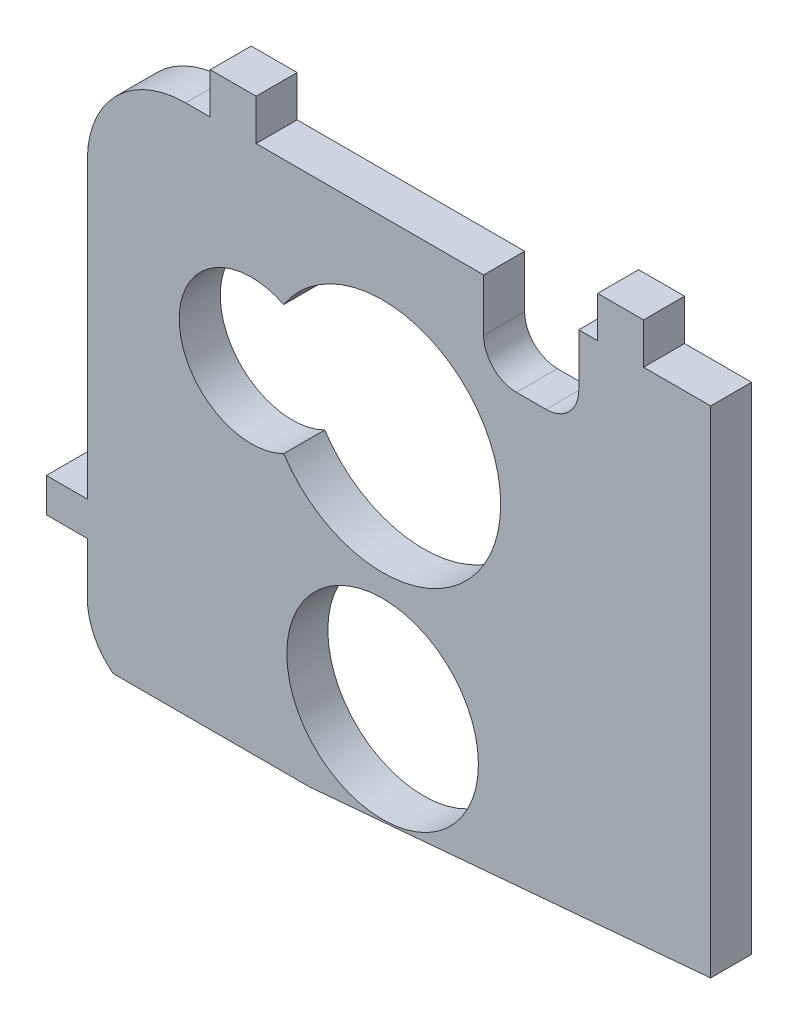
ISO-10303-21;
HEADER;
FILE_DESCRIPTION(('STEP AP214'),'2;1');
FILE_NAME('part.step','',(''),(''),'','','');
FILE_SCHEMA(('AUTOMOTIVE_DESIGN { 1 0 10303 214 1 1 1 1 }'));
ENDSEC;
DATA;
#1=APPLICATION_CONTEXT('core data for automotive mechanical design processes');
#2=APPLICATION_PROTOCOL_DEFINITION('international standard','automotive_design',2000,#1);
#3=PRODUCT_CONTEXT('',#1,'mechanical');
#4=PRODUCT('Part','Part','',(#3));
#5=PRODUCT_RELATED_PRODUCT_CATEGORY('part','',(#4));
#6=PRODUCT_DEFINITION_FORMATION('','',#4);
#7=PRODUCT_DEFINITION_CONTEXT('part definition',#1,'design');
#8=PRODUCT_DEFINITION('design','',#6,#7);
#9=PRODUCT_DEFINITION_SHAPE('','',#8);
#10=(LENGTH_UNIT() NAMED_UNIT(*) SI_UNIT(.MILLI.,.METRE.));
#11=(NAMED_UNIT(*) PLANE_ANGLE_UNIT() SI_UNIT($,.RADIAN.));
#12=(NAMED_UNIT(*) SI_UNIT($,.STERADIAN.) SOLID_ANGLE_UNIT());
#13=UNCERTAINTY_MEASURE_WITH_UNIT(LENGTH_MEASURE(1.E-05),#10,'distance_accuracy_value','');
#14=(GEOMETRIC_REPRESENTATION_CONTEXT(3) GLOBAL_UNCERTAINTY_ASSIGNED_CONTEXT((#13)) GLOBAL_UNIT_ASSIGNED_CONTEXT((#10,
#11,#12)) REPRESENTATION_CONTEXT('',''));
#15=CARTESIAN_POINT('',(0.,0.,0.));
#16=DIRECTION('',(0.,0.,1.));
#17=DIRECTION('',(1.,0.,0.));
#18=AXIS2_PLACEMENT_3D('',#15,#16,#17);
#19=CARTESIAN_POINT('',(0.632551457867364,16.51,1.5875));
#20=DIRECTION('',(0.,-1.,0.));
#21=DIRECTION('',(0.,0.,-1.));
#22=AXIS2_PLACEMENT_3D('',#19,#20,#21);
#23=PLANE('',#22);
#24=DIRECTION('',(-1.,0.,0.));
#25=VECTOR('',#24,1.);
#26=CARTESIAN_POINT('',(0.632551457867364,16.51,0.));
#27=LINE('',#26,#25);
#28=CARTESIAN_POINT('',(8.32562126019971,16.51,0.));
#29=VERTEX_POINT('',#28);
#30=CARTESIAN_POINT('',(7.59467738255905,16.51,0.));
#31=VERTEX_POINT('',#30);
#32=EDGE_CURVE('E274',#29,#31,#27,.T.);
#33=ORIENTED_EDGE('',*,*,#32,.T.);
#34=DIRECTION('',(0.,0.,1.));
#35=VECTOR('',#34,1.);
#36=CARTESIAN_POINT('',(7.59467738255905,16.51,0.));
#37=LINE('',#36,#35);
#38=CARTESIAN_POINT('',(7.59467738255905,16.51,1.5875));
#39=VERTEX_POINT('',#38);
#40=EDGE_CURVE('E286',#31,#39,#37,.T.);
#41=ORIENTED_EDGE('',*,*,#40,.T.);
#42=DIRECTION('',(-1.,0.,0.));
#43=VECTOR('',#42,1.);
#44=CARTESIAN_POINT('',(0.632551457867364,16.51,1.5875));
#45=LINE('',#44,#43);
#46=CARTESIAN_POINT('',(8.32562126019971,16.51,1.5875));
#47=VERTEX_POINT('',#46);
#48=EDGE_CURVE('E546',#47,#39,#45,.T.);
#49=ORIENTED_EDGE('',*,*,#48,.F.);
#50=DIRECTION('',(0.,0.,-1.));
#51=VECTOR('',#50,1.);
#52=CARTESIAN_POINT('',(8.32562126019971,16.51,1.5875));
#53=LINE('',#52,#51);
#54=EDGE_CURVE('E296',#47,#29,#53,.T.);
#55=ORIENTED_EDGE('',*,*,#54,.T.);
#56=EDGE_LOOP('',(#33,#41,#49,#55));
#57=FACE_BOUND('',#56,.T.);
#58=ADVANCED_FACE('F90',(#57),#23,.F.);
#59=CARTESIAN_POINT('',(-11.4299999999994,-19.1051794660288,1.5875));
#60=DIRECTION('',(1.,0.,0.));
#61=DIRECTION('',(0.,1.,0.));
#62=AXIS2_PLACEMENT_3D('',#59,#60,#61);
#63=PLANE('',#62);
#64=DIRECTION('',(0.,0.,-1.));
#65=VECTOR('',#64,1.);
#66=CARTESIAN_POINT('',(-11.4299999999998,1.3208,1.5875));
#67=LINE('',#66,#65);
#68=CARTESIAN_POINT('',(-11.4299999999998,1.3208,1.5875));
#69=VERTEX_POINT('',#68);
#70=CARTESIAN_POINT('',(-11.4299999999998,1.3208,0.));
#71=VERTEX_POINT('',#70);
#72=EDGE_CURVE('E342',#69,#71,#67,.T.);
#73=ORIENTED_EDGE('',*,*,#72,.F.);
#74=DIRECTION('',(0.,-1.,0.));
#75=VECTOR('',#74,1.);
#76=CARTESIAN_POINT('',(-11.4299999999994,-19.1051794660288,1.5875));
#77=LINE('',#76,#75);
#78=CARTESIAN_POINT('',(-11.43,12.7,1.5875));
#79=VERTEX_POINT('',#78);
#80=EDGE_CURVE('E562',#79,#69,#77,.T.);
#81=ORIENTED_EDGE('',*,*,#80,.F.);
#82=DIRECTION('',(0.,0.,-1.));
#83=VECTOR('',#82,1.);
#84=CARTESIAN_POINT('',(-11.43,12.7,1.5875));
#85=LINE('',#84,#83);
#86=CARTESIAN_POINT('',(-11.43,12.7,0.));
#87=VERTEX_POINT('',#86);
#88=EDGE_CURVE('E346',#79,#87,#85,.T.);
#89=ORIENTED_EDGE('',*,*,#88,.T.);
#90=DIRECTION('',(0.,-1.,0.));
#91=VECTOR('',#90,1.);
#92=CARTESIAN_POINT('',(-11.4299999999994,-19.1051794660288,0.));
#93=LINE('',#92,#91);
#94=EDGE_CURVE('E324',#87,#71,#93,.T.);
#95=ORIENTED_EDGE('',*,*,#94,.T.);
#96=EDGE_LOOP('',(#73,#81,#89,#95));
#97=FACE_BOUND('',#96,.T.);
#98=ADVANCED_FACE('F433',(#97),#63,.F.);
#99=CARTESIAN_POINT('',(-5.08,9.144,1.5875));
#100=DIRECTION('',(0.,0.,-1.));
#101=DIRECTION('',(-1.,0.,0.));
#102=AXIS2_PLACEMENT_3D('',#99,#100,#101);
#103=CYLINDRICAL_SURFACE('',#102,2.794);
#104=CARTESIAN_POINT('',(-5.08,9.144,0.));
#105=DIRECTION('',(0.,0.,1.));
#106=DIRECTION('',(1.,0.,0.));
#107=AXIS2_PLACEMENT_3D('',#104,#105,#106);
#108=CIRCLE('',#107,2.794);
#109=CARTESIAN_POINT('',(-3.82905,11.6423114492593,0.));
#110=VERTEX_POINT('',#109);
#111=CARTESIAN_POINT('',(-3.82905,6.64568855074072,0.));
#112=VERTEX_POINT('',#111);
#113=EDGE_CURVE('E327',#110,#112,#108,.T.);
#114=ORIENTED_EDGE('',*,*,#113,.F.);
#115=DIRECTION('',(0.,0.,-1.));
#116=VECTOR('',#115,1.);
#117=CARTESIAN_POINT('',(-3.82905,11.6423114492593,1.5875));
#118=LINE('',#117,#116);
#119=CARTESIAN_POINT('',(-3.82905,11.6423114492593,1.5875));
#120=VERTEX_POINT('',#119);
#121=EDGE_CURVE('E339',#120,#110,#118,.T.);
#122=ORIENTED_EDGE('',*,*,#121,.F.);
#123=CARTESIAN_POINT('',(-5.08,9.144,1.5875));
#124=DIRECTION('',(0.,0.,1.));
#125=DIRECTION('',(1.,0.,0.));
#126=AXIS2_PLACEMENT_3D('',#123,#124,#125);
#127=CIRCLE('',#126,2.794);
#128=CARTESIAN_POINT('',(-3.82905,6.64568855074072,1.5875));
#129=VERTEX_POINT('',#128);
#130=EDGE_CURVE('E565',#120,#129,#127,.T.);
#131=ORIENTED_EDGE('',*,*,#130,.T.);
#132=DIRECTION('',(0.,0.,-1.));
#133=VECTOR('',#132,1.);
#134=CARTESIAN_POINT('',(-3.82905,6.64568855074072,1.5875));
#135=LINE('',#134,#133);
#136=EDGE_CURVE('E337',#129,#112,#135,.T.);
#137=ORIENTED_EDGE('',*,*,#136,.T.);
#138=EDGE_LOOP('',(#114,#122,#131,#137));
#139=FACE_BOUND('',#138,.T.);
#140=ADVANCED_FACE('F441',(#139),#103,.F.);
#141=CARTESIAN_POINT('',(-8.88999999999971,-2.00942484477485,1.5875));
#142=DIRECTION('',(0.,0.,-1.));
#143=DIRECTION('',(-1.,0.,0.));
#144=AXIS2_PLACEMENT_3D('',#141,#142,#143);
#145=CYLINDRICAL_SURFACE('',#144,2.54);
#146=CARTESIAN_POINT('',(-8.88999999999971,-2.00942484477485,0.));
#147=DIRECTION('',(0.,0.,1.));
#148=DIRECTION('',(1.,0.,0.));
#149=AXIS2_PLACEMENT_3D('',#146,#147,#148);
#150=CIRCLE('',#149,2.54);
#151=CARTESIAN_POINT('',(-10.4312651908125,-4.02836060690026,0.));
#152=VERTEX_POINT('',#151);
#153=CARTESIAN_POINT('',(-11.4299999999997,-2.00942484477485,0.));
#154=VERTEX_POINT('',#153);
#155=EDGE_CURVE('E400',#152,#154,#150,.F.);
#156=ORIENTED_EDGE('',*,*,#155,.F.);
#157=DIRECTION('',(0.,0.,-1.));
#158=VECTOR('',#157,1.);
#159=CARTESIAN_POINT('',(-10.4312651908125,-4.02836060690026,1.5875));
#160=LINE('',#159,#158);
#161=CARTESIAN_POINT('',(-10.4312651908125,-4.02836060690026,1.5875));
#162=VERTEX_POINT('',#161);
#163=EDGE_CURVE('E340',#162,#152,#160,.T.);
#164=ORIENTED_EDGE('',*,*,#163,.F.);
#165=CARTESIAN_POINT('',(-8.88999999999971,-2.00942484477485,1.5875));
#166=DIRECTION('',(0.,0.,1.));
#167=DIRECTION('',(1.,0.,0.));
#168=AXIS2_PLACEMENT_3D('',#165,#166,#167);
#169=CIRCLE('',#168,2.54);
#170=CARTESIAN_POINT('',(-11.4299999999997,-2.00942484477485,1.5875));
#171=VERTEX_POINT('',#170);
#172=EDGE_CURVE('E336',#162,#171,#169,.F.);
#173=ORIENTED_EDGE('',*,*,#172,.T.);
#174=DIRECTION('',(0.,0.,-1.));
#175=VECTOR('',#174,1.);
#176=CARTESIAN_POINT('',(-11.4299999999997,-2.00942484477485,1.5875));
#177=LINE('',#176,#175);
#178=EDGE_CURVE('E343',#171,#154,#177,.T.);
#179=ORIENTED_EDGE('',*,*,#178,.T.);
#180=EDGE_LOOP('',(#156,#164,#173,#179));
#181=FACE_BOUND('',#180,.T.);
#182=ADVANCED_FACE('F475',(#181),#145,.T.);
#183=CARTESIAN_POINT('',(0.632551457867364,-4.02836060690026,1.5875));
#184=DIRECTION('',(0.,-1.,0.));
#185=DIRECTION('',(0.,0.,-1.));
#186=AXIS2_PLACEMENT_3D('',#183,#184,#185);
#187=PLANE('',#186);
#188=DIRECTION('',(-1.,0.,0.));
#189=VECTOR('',#188,1.);
#190=CARTESIAN_POINT('',(0.632551457867364,-4.02836060690026,0.));
#191=LINE('',#190,#189);
#192=CARTESIAN_POINT('',(-2.82330971300655,-4.02836060690026,0.));
#193=VERTEX_POINT('',#192);
#194=EDGE_CURVE('E575',#193,#152,#191,.T.);
#195=ORIENTED_EDGE('',*,*,#194,.F.);
#196=DIRECTION('',(0.,0.,-1.));
#197=VECTOR('',#196,1.);
#198=CARTESIAN_POINT('',(-2.82330971300655,-4.02836060690026,1.5875));
#199=LINE('',#198,#197);
#200=CARTESIAN_POINT('',(-2.82330971300655,-4.02836060690026,1.5875));
#201=VERTEX_POINT('',#200);
#202=EDGE_CURVE('E373',#201,#193,#199,.T.);
#203=ORIENTED_EDGE('',*,*,#202,.F.);
#204=DIRECTION('',(-1.,0.,0.));
#205=VECTOR('',#204,1.);
#206=CARTESIAN_POINT('',(0.632551457867364,-4.02836060690026,1.5875));
#207=LINE('',#206,#205);
#208=EDGE_CURVE('E534',#201,#162,#207,.T.);
#209=ORIENTED_EDGE('',*,*,#208,.T.);
#210=ORIENTED_EDGE('',*,*,#163,.T.);
#211=EDGE_LOOP('',(#195,#203,#209,#210));
#212=FACE_BOUND('',#211,.T.);
#213=ADVANCED_FACE('F478',(#212),#187,.T.);
#214=CARTESIAN_POINT('',(-0.702730750315264,-3.84283398755323,1.5875));
#215=DIRECTION('',(0.0871557427476512,-0.996194698091746,0.));
#216=DIRECTION('',(0.996194698091746,0.0871557427476512,0.));
#217=AXIS2_PLACEMENT_3D('',#214,#215,#216);
#218=PLANE('',#217);
#219=DIRECTION('',(-0.996194698091746,-0.0871557427476512,0.));
#220=VECTOR('',#219,1.);
#221=CARTESIAN_POINT('',(-0.702730750315264,-3.84283398755323,0.));
#222=LINE('',#221,#220);
#223=CARTESIAN_POINT('',(12.7,-2.67024698661043,0.));
#224=VERTEX_POINT('',#223);
#225=EDGE_CURVE('E578',#224,#193,#222,.T.);
#226=ORIENTED_EDGE('',*,*,#225,.F.);
#227=DIRECTION('',(0.,0.,-1.));
#228=VECTOR('',#227,1.);
#229=CARTESIAN_POINT('',(12.7,-2.67024698661043,1.5875));
#230=LINE('',#229,#228);
#231=CARTESIAN_POINT('',(12.7,-2.67024698661043,1.5875));
#232=VERTEX_POINT('',#231);
#233=EDGE_CURVE('E371',#232,#224,#230,.T.);
#234=ORIENTED_EDGE('',*,*,#233,.F.);
#235=DIRECTION('',(-0.996194698091746,-0.0871557427476512,0.));
#236=VECTOR('',#235,1.);
#237=CARTESIAN_POINT('',(-0.702730750315264,-3.84283398755323,1.5875));
#238=LINE('',#237,#236);
#239=EDGE_CURVE('E537',#232,#201,#238,.T.);
#240=ORIENTED_EDGE('',*,*,#239,.T.);
#241=ORIENTED_EDGE('',*,*,#202,.T.);
#242=EDGE_LOOP('',(#226,#234,#240,#241));
#243=FACE_BOUND('',#242,.T.);
#244=ADVANCED_FACE('F482',(#243),#218,.T.);
#245=CARTESIAN_POINT('',(12.7,-19.1051794660285,1.5875));
#246=DIRECTION('',(1.,0.,0.));
#247=DIRECTION('',(0.,1.,0.));
#248=AXIS2_PLACEMENT_3D('',#245,#246,#247);
#249=PLANE('',#248);
#250=DIRECTION('',(0.,-1.,0.));
#251=VECTOR('',#250,1.);
#252=CARTESIAN_POINT('',(12.7,-19.1051794660285,0.));
#253=LINE('',#252,#251);
#254=CARTESIAN_POINT('',(12.7,16.51,0.));
#255=VERTEX_POINT('',#254);
#256=EDGE_CURVE('E309',#255,#224,#253,.T.);
#257=ORIENTED_EDGE('',*,*,#256,.F.);
#258=DIRECTION('',(0.,0.,-1.));
#259=VECTOR('',#258,1.);
#260=CARTESIAN_POINT('',(12.7,16.51,1.5875));
#261=LINE('',#260,#259);
#262=CARTESIAN_POINT('',(12.7,16.51,1.5875));
#263=VERTEX_POINT('',#262);
#264=EDGE_CURVE('E369',#263,#255,#261,.T.);
#265=ORIENTED_EDGE('',*,*,#264,.F.);
#266=DIRECTION('',(0.,-1.,0.));
#267=VECTOR('',#266,1.);
#268=CARTESIAN_POINT('',(12.7,-19.1051794660285,1.5875));
#269=LINE('',#268,#267);
#270=EDGE_CURVE('E540',#263,#232,#269,.T.);
#271=ORIENTED_EDGE('',*,*,#270,.T.);
#272=ORIENTED_EDGE('',*,*,#233,.T.);
#273=EDGE_LOOP('',(#257,#265,#271,#272));
#274=FACE_BOUND('',#273,.T.);
#275=ADVANCED_FACE('F450',(#274),#249,.T.);
#276=CARTESIAN_POINT('',(10.1036212601997,16.51,0.));
#277=VERTEX_POINT('',#276);
#278=EDGE_CURVE('E300',#255,#277,#27,.T.);
#279=ORIENTED_EDGE('',*,*,#278,.T.);
#280=DIRECTION('',(0.,0.,-1.));
#281=VECTOR('',#280,1.);
#282=CARTESIAN_POINT('',(10.1036212601997,16.51,1.5875));
#283=LINE('',#282,#281);
#284=CARTESIAN_POINT('',(10.1036212601997,16.51,1.5875));
#285=VERTEX_POINT('',#284);
#286=EDGE_CURVE('E366',#285,#277,#283,.T.);
#287=ORIENTED_EDGE('',*,*,#286,.F.);
#288=EDGE_CURVE('E543',#263,#285,#45,.T.);
#289=ORIENTED_EDGE('',*,*,#288,.F.);
#290=ORIENTED_EDGE('',*,*,#264,.T.);
#291=EDGE_LOOP('',(#279,#287,#289,#290));
#292=FACE_BOUND('',#291,.T.);
#293=ADVANCED_FACE('F435',(#292),#23,.F.);
#294=CARTESIAN_POINT('',(10.1036212601997,-19.1051794660285,1.5875));
#295=DIRECTION('',(-1.,0.,0.));
#296=DIRECTION('',(0.,0.,1.));
#297=AXIS2_PLACEMENT_3D('',#294,#295,#296);
#298=PLANE('',#297);
#299=DIRECTION('',(0.,1.,0.));
#300=VECTOR('',#299,1.);
#301=CARTESIAN_POINT('',(10.1036212601997,-19.1051794660285,0.));
#302=LINE('',#301,#300);
#303=CARTESIAN_POINT('',(10.1036212601997,18.0975,0.));
#304=VERTEX_POINT('',#303);
#305=EDGE_CURVE('E308',#277,#304,#302,.T.);
#306=ORIENTED_EDGE('',*,*,#305,.T.);
#307=DIRECTION('',(0.,0.,-1.));
#308=VECTOR('',#307,1.);
#309=CARTESIAN_POINT('',(10.1036212601997,18.0975,1.5875));
#310=LINE('',#309,#308);
#311=CARTESIAN_POINT('',(10.1036212601997,18.0975,1.5875));
#312=VERTEX_POINT('',#311);
#313=EDGE_CURVE('E364',#312,#304,#310,.T.);
#314=ORIENTED_EDGE('',*,*,#313,.F.);
#315=DIRECTION('',(0.,1.,0.));
#316=VECTOR('',#315,1.);
#317=CARTESIAN_POINT('',(10.1036212601997,-19.1051794660285,1.5875));
#318=LINE('',#317,#316);
#319=EDGE_CURVE('E545',#285,#312,#318,.T.);
#320=ORIENTED_EDGE('',*,*,#319,.F.);
#321=ORIENTED_EDGE('',*,*,#286,.T.);
#322=EDGE_LOOP('',(#306,#314,#320,#321));
#323=FACE_BOUND('',#322,.T.);
#324=ADVANCED_FACE('F449',(#323),#298,.F.);
#325=CARTESIAN_POINT('',(0.632551457867509,18.0975,1.5875));
#326=DIRECTION('',(0.,1.,0.));
#327=DIRECTION('',(-1.,0.,0.));
#328=AXIS2_PLACEMENT_3D('',#325,#326,#327);
#329=PLANE('',#328);
#330=DIRECTION('',(1.,0.,0.));
#331=VECTOR('',#330,1.);
#332=CARTESIAN_POINT('',(0.632551457867509,18.0975,0.));
#333=LINE('',#332,#331);
#334=CARTESIAN_POINT('',(8.32562126019971,18.0975,0.));
#335=VERTEX_POINT('',#334);
#336=EDGE_CURVE('E612',#335,#304,#333,.T.);
#337=ORIENTED_EDGE('',*,*,#336,.F.);
#338=DIRECTION('',(0.,0.,-1.));
#339=VECTOR('',#338,1.);
#340=CARTESIAN_POINT('',(8.32562126019971,18.0975,1.5875));
#341=LINE('',#340,#339);
#342=CARTESIAN_POINT('',(8.32562126019971,18.0975,1.5875));
#343=VERTEX_POINT('',#342);
#344=EDGE_CURVE('E362',#343,#335,#341,.T.);
#345=ORIENTED_EDGE('',*,*,#344,.F.);
#346=DIRECTION('',(1.,0.,0.));
#347=VECTOR('',#346,1.);
#348=CARTESIAN_POINT('',(0.632551457867509,18.0975,1.5875));
#349=LINE('',#348,#347);
#350=EDGE_CURVE('E548',#343,#312,#349,.T.);
#351=ORIENTED_EDGE('',*,*,#350,.T.);
#352=ORIENTED_EDGE('',*,*,#313,.T.);
#353=EDGE_LOOP('',(#337,#345,#351,#352));
#354=FACE_BOUND('',#353,.T.);
#355=ADVANCED_FACE('F492',(#354),#329,.T.);
#356=CARTESIAN_POINT('',(8.32562126019971,-19.1051794660285,1.5875));
#357=DIRECTION('',(-1.,0.,0.));
#358=DIRECTION('',(0.,0.,1.));
#359=AXIS2_PLACEMENT_3D('',#356,#357,#358);
#360=PLANE('',#359);
#361=DIRECTION('',(0.,1.,0.));
#362=VECTOR('',#361,1.);
#363=CARTESIAN_POINT('',(8.32562126019971,-19.1051794660285,0.));
#364=LINE('',#363,#362);
#365=EDGE_CURVE('E305',#29,#335,#364,.T.);
#366=ORIENTED_EDGE('',*,*,#365,.F.);
#367=ORIENTED_EDGE('',*,*,#54,.F.);
#368=DIRECTION('',(0.,1.,0.));
#369=VECTOR('',#368,1.);
#370=CARTESIAN_POINT('',(8.32562126019971,-19.1051794660285,1.5875));
#371=LINE('',#370,#369);
#372=EDGE_CURVE('E551',#47,#343,#371,.T.);
#373=ORIENTED_EDGE('',*,*,#372,.T.);
#374=ORIENTED_EDGE('',*,*,#344,.T.);
#375=EDGE_LOOP('',(#366,#367,#373,#374));
#376=FACE_BOUND('',#375,.T.);
#377=ADVANCED_FACE('F496',(#376),#360,.T.);
#378=CARTESIAN_POINT('',(3.91167738255905,16.51,1.5875));
#379=VERTEX_POINT('',#378);
#380=CARTESIAN_POINT('',(-4.89637873980029,16.51,1.5875));
#381=VERTEX_POINT('',#380);
#382=EDGE_CURVE('E528',#379,#381,#45,.T.);
#383=ORIENTED_EDGE('',*,*,#382,.F.);
#384=DIRECTION('',(0.,0.,1.));
#385=VECTOR('',#384,1.);
#386=CARTESIAN_POINT('',(3.91167738255905,16.51,0.));
#387=LINE('',#386,#385);
#388=CARTESIAN_POINT('',(3.91167738255905,16.51,0.));
#389=VERTEX_POINT('',#388);
#390=EDGE_CURVE('E293',#389,#379,#387,.T.);
#391=ORIENTED_EDGE('',*,*,#390,.F.);
#392=CARTESIAN_POINT('',(-4.89637873980029,16.51,0.));
#393=VERTEX_POINT('',#392);
#394=EDGE_CURVE('E298',#389,#393,#27,.T.);
#395=ORIENTED_EDGE('',*,*,#394,.T.);
#396=DIRECTION('',(0.,0.,-1.));
#397=VECTOR('',#396,1.);
#398=CARTESIAN_POINT('',(-4.89637873980029,16.51,1.5875));
#399=LINE('',#398,#397);
#400=EDGE_CURVE('E358',#381,#393,#399,.T.);
#401=ORIENTED_EDGE('',*,*,#400,.F.);
#402=EDGE_LOOP('',(#383,#391,#395,#401));
#403=FACE_BOUND('',#402,.T.);
#404=ADVANCED_FACE('F452',(#403),#23,.F.);
#405=CARTESIAN_POINT('',(-4.89637873980029,-19.1051794660285,1.5875));
#406=DIRECTION('',(-1.,0.,0.));
#407=DIRECTION('',(0.,0.,1.));
#408=AXIS2_PLACEMENT_3D('',#405,#406,#407);
#409=PLANE('',#408);
#410=DIRECTION('',(0.,1.,0.));
#411=VECTOR('',#410,1.);
#412=CARTESIAN_POINT('',(-4.89637873980029,-19.1051794660285,0.));
#413=LINE('',#412,#411);
#414=CARTESIAN_POINT('',(-4.89637873980029,18.0975,0.));
#415=VERTEX_POINT('',#414);
#416=EDGE_CURVE('E297',#393,#415,#413,.T.);
#417=ORIENTED_EDGE('',*,*,#416,.T.);
#418=DIRECTION('',(0.,0.,-1.));
#419=VECTOR('',#418,1.);
#420=CARTESIAN_POINT('',(-4.89637873980029,18.0975,1.5875));
#421=LINE('',#420,#419);
#422=CARTESIAN_POINT('',(-4.89637873980029,18.0975,1.5875));
#423=VERTEX_POINT('',#422);
#424=EDGE_CURVE('E356',#423,#415,#421,.T.);
#425=ORIENTED_EDGE('',*,*,#424,.F.);
#426=DIRECTION('',(0.,1.,0.));
#427=VECTOR('',#426,1.);
#428=CARTESIAN_POINT('',(-4.89637873980029,-19.1051794660285,1.5875));
#429=LINE('',#428,#427);
#430=EDGE_CURVE('E524',#381,#423,#429,.T.);
#431=ORIENTED_EDGE('',*,*,#430,.F.);
#432=ORIENTED_EDGE('',*,*,#400,.T.);
#433=EDGE_LOOP('',(#417,#425,#431,#432));
#434=FACE_BOUND('',#433,.T.);
#435=ADVANCED_FACE('F501',(#434),#409,.F.);
#436=CARTESIAN_POINT('',(0.632551457867509,18.0975,1.5875));
#437=DIRECTION('',(0.,1.,0.));
#438=DIRECTION('',(-1.,0.,0.));
#439=AXIS2_PLACEMENT_3D('',#436,#437,#438);
#440=PLANE('',#439);
#441=DIRECTION('',(1.,0.,0.));
#442=VECTOR('',#441,1.);
#443=CARTESIAN_POINT('',(0.632551457867509,18.0975,0.));
#444=LINE('',#443,#442);
#445=CARTESIAN_POINT('',(-6.67437873980029,18.0975,0.));
#446=VERTEX_POINT('',#445);
#447=EDGE_CURVE('E303',#446,#415,#444,.T.);
#448=ORIENTED_EDGE('',*,*,#447,.F.);
#449=DIRECTION('',(0.,0.,-1.));
#450=VECTOR('',#449,1.);
#451=CARTESIAN_POINT('',(-6.67437873980029,18.0975,1.5875));
#452=LINE('',#451,#450);
#453=CARTESIAN_POINT('',(-6.67437873980029,18.0975,1.5875));
#454=VERTEX_POINT('',#453);
#455=EDGE_CURVE('E354',#454,#446,#452,.T.);
#456=ORIENTED_EDGE('',*,*,#455,.F.);
#457=DIRECTION('',(1.,0.,0.));
#458=VECTOR('',#457,1.);
#459=CARTESIAN_POINT('',(0.632551457867509,18.0975,1.5875));
#460=LINE('',#459,#458);
#461=EDGE_CURVE('E555',#454,#423,#460,.T.);
#462=ORIENTED_EDGE('',*,*,#461,.T.);
#463=ORIENTED_EDGE('',*,*,#424,.T.);
#464=EDGE_LOOP('',(#448,#456,#462,#463));
#465=FACE_BOUND('',#464,.T.);
#466=ADVANCED_FACE('F504',(#465),#440,.T.);
#467=CARTESIAN_POINT('',(-6.67437873980029,-19.1051794660285,1.5875));
#468=DIRECTION('',(-1.,0.,0.));
#469=DIRECTION('',(0.,0.,1.));
#470=AXIS2_PLACEMENT_3D('',#467,#468,#469);
#471=PLANE('',#470);
#472=DIRECTION('',(0.,1.,0.));
#473=VECTOR('',#472,1.);
#474=CARTESIAN_POINT('',(-6.67437873980029,-19.1051794660285,0.));
#475=LINE('',#474,#473);
#476=CARTESIAN_POINT('',(-6.67437873980029,16.51,0.));
#477=VERTEX_POINT('',#476);
#478=EDGE_CURVE('E311',#477,#446,#475,.T.);
#479=ORIENTED_EDGE('',*,*,#478,.F.);
#480=DIRECTION('',(0.,0.,-1.));
#481=VECTOR('',#480,1.);
#482=CARTESIAN_POINT('',(-6.67437873980029,16.51,1.5875));
#483=LINE('',#482,#481);
#484=CARTESIAN_POINT('',(-6.67437873980029,16.51,1.5875));
#485=VERTEX_POINT('',#484);
#486=EDGE_CURVE('E352',#485,#477,#483,.T.);
#487=ORIENTED_EDGE('',*,*,#486,.F.);
#488=DIRECTION('',(0.,1.,0.));
#489=VECTOR('',#488,1.);
#490=CARTESIAN_POINT('',(-6.67437873980029,-19.1051794660285,1.5875));
#491=LINE('',#490,#489);
#492=EDGE_CURVE('E516',#485,#454,#491,.T.);
#493=ORIENTED_EDGE('',*,*,#492,.T.);
#494=ORIENTED_EDGE('',*,*,#455,.T.);
#495=EDGE_LOOP('',(#479,#487,#493,#494));
#496=FACE_BOUND('',#495,.T.);
#497=ADVANCED_FACE('F455',(#496),#471,.T.);
#498=CARTESIAN_POINT('',(-7.62,16.51,0.));
#499=VERTEX_POINT('',#498);
#500=EDGE_CURVE('E301',#477,#499,#27,.T.);
#501=ORIENTED_EDGE('',*,*,#500,.T.);
#502=DIRECTION('',(0.,0.,-1.));
#503=VECTOR('',#502,1.);
#504=CARTESIAN_POINT('',(-7.62,16.51,1.5875));
#505=LINE('',#504,#503);
#506=CARTESIAN_POINT('',(-7.62,16.51,1.5875));
#507=VERTEX_POINT('',#506);
#508=EDGE_CURVE('E350',#507,#499,#505,.T.);
#509=ORIENTED_EDGE('',*,*,#508,.F.);
#510=EDGE_CURVE('E558',#485,#507,#45,.T.);
#511=ORIENTED_EDGE('',*,*,#510,.F.);
#512=ORIENTED_EDGE('',*,*,#486,.T.);
#513=EDGE_LOOP('',(#501,#509,#511,#512));
#514=FACE_BOUND('',#513,.T.);
#515=ADVANCED_FACE('F436',(#514),#23,.F.);
#516=CARTESIAN_POINT('',(-7.62,12.7,1.5875));
#517=DIRECTION('',(0.,0.,-1.));
#518=DIRECTION('',(-1.,0.,0.));
#519=AXIS2_PLACEMENT_3D('',#516,#517,#518);
#520=CYLINDRICAL_SURFACE('',#519,3.81);
#521=CARTESIAN_POINT('',(-7.62,12.7,0.));
#522=DIRECTION('',(0.,0.,1.));
#523=DIRECTION('',(1.,0.,0.));
#524=AXIS2_PLACEMENT_3D('',#521,#522,#523);
#525=CIRCLE('',#524,3.81);
#526=EDGE_CURVE('E310',#499,#87,#525,.T.);
#527=ORIENTED_EDGE('',*,*,#526,.T.);
#528=ORIENTED_EDGE('',*,*,#88,.F.);
#529=CARTESIAN_POINT('',(-7.62,12.7,1.5875));
#530=DIRECTION('',(0.,0.,1.));
#531=DIRECTION('',(1.,0.,0.));
#532=AXIS2_PLACEMENT_3D('',#529,#530,#531);
#533=CIRCLE('',#532,3.81);
#534=EDGE_CURVE('E559',#507,#79,#533,.T.);
#535=ORIENTED_EDGE('',*,*,#534,.F.);
#536=ORIENTED_EDGE('',*,*,#508,.T.);
#537=EDGE_LOOP('',(#527,#528,#535,#536));
#538=FACE_BOUND('',#537,.T.);
#539=ADVANCED_FACE('F454',(#538),#520,.T.);
#540=CARTESIAN_POINT('',(0.,9.144,1.5875));
#541=DIRECTION('',(0.,0.,-1.));
#542=DIRECTION('',(-1.,0.,0.));
#543=AXIS2_PLACEMENT_3D('',#540,#541,#542);
#544=CYLINDRICAL_SURFACE('',#543,4.572);
#545=CARTESIAN_POINT('',(0.,9.144,0.));
#546=DIRECTION('',(0.,0.,1.));
#547=DIRECTION('',(1.,0.,0.));
#548=AXIS2_PLACEMENT_3D('',#545,#546,#547);
#549=CIRCLE('',#548,4.572);
#550=EDGE_CURVE('E330',#112,#110,#549,.T.);
#551=ORIENTED_EDGE('',*,*,#550,.F.);
#552=ORIENTED_EDGE('',*,*,#136,.F.);
#553=CARTESIAN_POINT('',(0.,9.144,1.5875));
#554=DIRECTION('',(0.,0.,1.));
#555=DIRECTION('',(1.,0.,0.));
#556=AXIS2_PLACEMENT_3D('',#553,#554,#555);
#557=CIRCLE('',#556,4.572);
#558=EDGE_CURVE('E568',#129,#120,#557,.T.);
#559=ORIENTED_EDGE('',*,*,#558,.T.);
#560=ORIENTED_EDGE('',*,*,#121,.T.);
#561=EDGE_LOOP('',(#551,#552,#559,#560));
#562=FACE_BOUND('',#561,.T.);
#563=ADVANCED_FACE('F624',(#562),#544,.F.);
#564=CARTESIAN_POINT('',(-11.4299999999997,0.,1.5875));
#565=VERTEX_POINT('',#564);
#566=EDGE_CURVE('E561',#565,#171,#77,.T.);
#567=ORIENTED_EDGE('',*,*,#566,.F.);
#568=DIRECTION('',(0.,0.,-1.));
#569=VECTOR('',#568,1.);
#570=CARTESIAN_POINT('',(-11.4299999999997,0.,1.5875));
#571=LINE('',#570,#569);
#572=CARTESIAN_POINT('',(-11.4299999999997,0.,0.));
#573=VERTEX_POINT('',#572);
#574=EDGE_CURVE('E377',#565,#573,#571,.T.);
#575=ORIENTED_EDGE('',*,*,#574,.T.);
#576=EDGE_CURVE('E316',#573,#154,#93,.T.);
#577=ORIENTED_EDGE('',*,*,#576,.T.);
#578=ORIENTED_EDGE('',*,*,#178,.F.);
#579=EDGE_LOOP('',(#567,#575,#577,#578));
#580=FACE_BOUND('',#579,.T.);
#581=ADVANCED_FACE('F444',(#580),#63,.F.);
#582=CARTESIAN_POINT('',(0.,0.,1.5875));
#583=DIRECTION('',(0.,0.,-1.));
#584=DIRECTION('',(-1.,0.,0.));
#585=AXIS2_PLACEMENT_3D('',#582,#583,#584);
#586=CYLINDRICAL_SURFACE('',#585,3.7084);
#587=CARTESIAN_POINT('',(0.,0.,1.5875));
#588=DIRECTION('',(0.,0.,1.));
#589=DIRECTION('',(1.,0.,0.));
#590=AXIS2_PLACEMENT_3D('',#587,#588,#589);
#591=CIRCLE('',#590,3.7084);
#592=CARTESIAN_POINT('',(3.7084,0.,1.5875));
#593=VERTEX_POINT('',#592);
#594=EDGE_CURVE('E347',#593,#593,#591,.T.);
#595=ORIENTED_EDGE('',*,*,#594,.T.);
#596=EDGE_LOOP('',(#595));
#597=FACE_BOUND('',#596,.T.);
#598=CARTESIAN_POINT('',(0.,0.,0.));
#599=DIRECTION('',(0.,0.,1.));
#600=DIRECTION('',(1.,0.,0.));
#601=AXIS2_PLACEMENT_3D('',#598,#599,#600);
#602=CIRCLE('',#601,3.7084);
#603=CARTESIAN_POINT('',(3.7084,0.,0.));
#604=VERTEX_POINT('',#603);
#605=EDGE_CURVE('E333',#604,#604,#602,.T.);
#606=ORIENTED_EDGE('',*,*,#605,.F.);
#607=EDGE_LOOP('',(#606));
#608=FACE_BOUND('',#607,.T.);
#609=ADVANCED_FACE('F632',(#597,#608),#586,.F.);
#610=CARTESIAN_POINT('',(0.632551457867364,-19.1051794660285,1.5875));
#611=DIRECTION('',(0.,0.,1.));
#612=DIRECTION('',(1.,0.,0.));
#613=AXIS2_PLACEMENT_3D('',#610,#611,#612);
#614=PLANE('',#613);
#615=DIRECTION('',(0.,1.,0.));
#616=VECTOR('',#615,1.);
#617=CARTESIAN_POINT('',(7.59467738255905,16.51,1.5875));
#618=LINE('',#617,#616);
#619=CARTESIAN_POINT('',(7.59467738255905,14.478,1.5875));
#620=VERTEX_POINT('',#619);
#621=EDGE_CURVE('E289',#620,#39,#618,.T.);
#622=ORIENTED_EDGE('',*,*,#621,.F.);
#623=CARTESIAN_POINT('',(6.32467738255905,14.478,1.5875));
#624=DIRECTION('',(0.,0.,1.));
#625=DIRECTION('',(1.,0.,0.));
#626=AXIS2_PLACEMENT_3D('',#623,#624,#625);
#627=CIRCLE('',#626,1.27);
#628=CARTESIAN_POINT('',(6.32467738255905,13.208,1.5875));
#629=VERTEX_POINT('',#628);
#630=EDGE_CURVE('E409',#620,#629,#627,.F.);
#631=ORIENTED_EDGE('',*,*,#630,.T.);
#632=DIRECTION('',(1.,0.,0.));
#633=VECTOR('',#632,1.);
#634=CARTESIAN_POINT('',(7.59467738255905,13.208,1.5875));
#635=LINE('',#634,#633);
#636=CARTESIAN_POINT('',(5.18167738255905,13.208,1.5875));
#637=VERTEX_POINT('',#636);
#638=EDGE_CURVE('E283',#637,#629,#635,.T.);
#639=ORIENTED_EDGE('',*,*,#638,.F.);
#640=CARTESIAN_POINT('',(5.18167738255905,14.478,1.5875));
#641=DIRECTION('',(0.,0.,1.));
#642=DIRECTION('',(1.,0.,0.));
#643=AXIS2_PLACEMENT_3D('',#640,#641,#642);
#644=CIRCLE('',#643,1.27);
#645=CARTESIAN_POINT('',(3.91167738255905,14.478,1.5875));
#646=VERTEX_POINT('',#645);
#647=EDGE_CURVE('E98',#637,#646,#644,.F.);
#648=ORIENTED_EDGE('',*,*,#647,.T.);
#649=DIRECTION('',(0.,-1.,0.));
#650=VECTOR('',#649,1.);
#651=CARTESIAN_POINT('',(3.91167738255905,16.51,1.5875));
#652=LINE('',#651,#650);
#653=EDGE_CURVE('E420',#379,#646,#652,.T.);
#654=ORIENTED_EDGE('',*,*,#653,.F.);
#655=ORIENTED_EDGE('',*,*,#382,.T.);
#656=ORIENTED_EDGE('',*,*,#430,.T.);
#657=ORIENTED_EDGE('',*,*,#461,.F.);
#658=ORIENTED_EDGE('',*,*,#492,.F.);
#659=ORIENTED_EDGE('',*,*,#510,.T.);
#660=ORIENTED_EDGE('',*,*,#534,.T.);
#661=ORIENTED_EDGE('',*,*,#80,.T.);
#662=DIRECTION('',(-1.,0.,0.));
#663=VECTOR('',#662,1.);
#664=CARTESIAN_POINT('',(-11.4299999999997,1.3208,1.5875));
#665=LINE('',#664,#663);
#666=CARTESIAN_POINT('',(-13.0174999999997,1.3208,1.5875));
#667=VERTEX_POINT('',#666);
#668=EDGE_CURVE('E387',#69,#667,#665,.T.);
#669=ORIENTED_EDGE('',*,*,#668,.T.);
#670=DIRECTION('',(0.,1.,0.));
#671=VECTOR('',#670,1.);
#672=CARTESIAN_POINT('',(-13.0174999999997,0.,1.5875));
#673=LINE('',#672,#671);
#674=CARTESIAN_POINT('',(-13.0174999999997,0.,1.5875));
#675=VERTEX_POINT('',#674);
#676=EDGE_CURVE('E383',#675,#667,#673,.T.);
#677=ORIENTED_EDGE('',*,*,#676,.F.);
#678=DIRECTION('',(-1.,0.,0.));
#679=VECTOR('',#678,1.);
#680=CARTESIAN_POINT('',(-11.4299999999949,0.,1.5875));
#681=LINE('',#680,#679);
#682=EDGE_CURVE('E380',#565,#675,#681,.T.);
#683=ORIENTED_EDGE('',*,*,#682,.F.);
#684=ORIENTED_EDGE('',*,*,#566,.T.);
#685=ORIENTED_EDGE('',*,*,#172,.F.);
#686=ORIENTED_EDGE('',*,*,#208,.F.);
#687=ORIENTED_EDGE('',*,*,#239,.F.);
#688=ORIENTED_EDGE('',*,*,#270,.F.);
#689=ORIENTED_EDGE('',*,*,#288,.T.);
#690=ORIENTED_EDGE('',*,*,#319,.T.);
#691=ORIENTED_EDGE('',*,*,#350,.F.);
#692=ORIENTED_EDGE('',*,*,#372,.F.);
#693=ORIENTED_EDGE('',*,*,#48,.T.);
#694=EDGE_LOOP('',(#622,#631,#639,#648,#654,#655,#656,#657,#658,#659,#660,#661,#669,#677,#683,
#684,#685,#686,#687,#688,#689,#690,#691,#692,#693));
#695=FACE_BOUND('',#694,.T.);
#696=ORIENTED_EDGE('',*,*,#130,.F.);
#697=ORIENTED_EDGE('',*,*,#558,.F.);
#698=EDGE_LOOP('',(#696,#697));
#699=FACE_BOUND('',#698,.T.);
#700=ORIENTED_EDGE('',*,*,#594,.F.);
#701=EDGE_LOOP('',(#700));
#702=FACE_BOUND('',#701,.T.);
#703=ADVANCED_FACE('F412',(#695,#699,#702),#614,.T.);
#704=CARTESIAN_POINT('',(0.632551457867364,-19.1051794660285,0.));
#705=DIRECTION('',(0.,0.,1.));
#706=DIRECTION('',(1.,0.,0.));
#707=AXIS2_PLACEMENT_3D('',#704,#705,#706);
#708=PLANE('',#707);
#709=DIRECTION('',(0.,-1.,0.));
#710=VECTOR('',#709,1.);
#711=CARTESIAN_POINT('',(3.91167738255905,16.51,0.));
#712=LINE('',#711,#710);
#713=CARTESIAN_POINT('',(3.91167738255905,14.478,0.));
#714=VERTEX_POINT('',#713);
#715=EDGE_CURVE('E282',#389,#714,#712,.T.);
#716=ORIENTED_EDGE('',*,*,#715,.T.);
#717=CARTESIAN_POINT('',(5.18167738255905,14.478,0.));
#718=DIRECTION('',(0.,0.,1.));
#719=DIRECTION('',(1.,0.,0.));
#720=AXIS2_PLACEMENT_3D('',#717,#718,#719);
#721=CIRCLE('',#720,1.27);
#722=CARTESIAN_POINT('',(5.18167738255905,13.208,0.));
#723=VERTEX_POINT('',#722);
#724=EDGE_CURVE('E12',#714,#723,#721,.T.);
#725=ORIENTED_EDGE('',*,*,#724,.T.);
#726=DIRECTION('',(1.,0.,0.));
#727=VECTOR('',#726,1.);
#728=CARTESIAN_POINT('',(7.59467738255905,13.208,0.));
#729=LINE('',#728,#727);
#730=CARTESIAN_POINT('',(6.32467738255905,13.208,0.));
#731=VERTEX_POINT('',#730);
#732=EDGE_CURVE('E294',#723,#731,#729,.T.);
#733=ORIENTED_EDGE('',*,*,#732,.T.);
#734=CARTESIAN_POINT('',(6.32467738255905,14.478,0.));
#735=DIRECTION('',(0.,0.,1.));
#736=DIRECTION('',(1.,0.,0.));
#737=AXIS2_PLACEMENT_3D('',#734,#735,#736);
#738=CIRCLE('',#737,1.27);
#739=CARTESIAN_POINT('',(7.59467738255905,14.478,0.));
#740=VERTEX_POINT('',#739);
#741=EDGE_CURVE('E278',#731,#740,#738,.T.);
#742=ORIENTED_EDGE('',*,*,#741,.T.);
#743=DIRECTION('',(0.,1.,0.));
#744=VECTOR('',#743,1.);
#745=CARTESIAN_POINT('',(7.59467738255905,16.51,0.));
#746=LINE('',#745,#744);
#747=EDGE_CURVE('E268',#740,#31,#746,.T.);
#748=ORIENTED_EDGE('',*,*,#747,.T.);
#749=ORIENTED_EDGE('',*,*,#32,.F.);
#750=ORIENTED_EDGE('',*,*,#365,.T.);
#751=ORIENTED_EDGE('',*,*,#336,.T.);
#752=ORIENTED_EDGE('',*,*,#305,.F.);
#753=ORIENTED_EDGE('',*,*,#278,.F.);
#754=ORIENTED_EDGE('',*,*,#256,.T.);
#755=ORIENTED_EDGE('',*,*,#225,.T.);
#756=ORIENTED_EDGE('',*,*,#194,.T.);
#757=ORIENTED_EDGE('',*,*,#155,.T.);
#758=ORIENTED_EDGE('',*,*,#576,.F.);
#759=DIRECTION('',(-1.,0.,0.));
#760=VECTOR('',#759,1.);
#761=CARTESIAN_POINT('',(-11.4299999999949,0.,0.));
#762=LINE('',#761,#760);
#763=CARTESIAN_POINT('',(-13.0174999999997,0.,0.));
#764=VERTEX_POINT('',#763);
#765=EDGE_CURVE('E390',#573,#764,#762,.T.);
#766=ORIENTED_EDGE('',*,*,#765,.T.);
#767=DIRECTION('',(0.,1.,0.));
#768=VECTOR('',#767,1.);
#769=CARTESIAN_POINT('',(-13.0174999999997,0.,0.));
#770=LINE('',#769,#768);
#771=CARTESIAN_POINT('',(-13.0174999999997,1.3208,0.));
#772=VERTEX_POINT('',#771);
#773=EDGE_CURVE('E393',#764,#772,#770,.T.);
#774=ORIENTED_EDGE('',*,*,#773,.T.);
#775=DIRECTION('',(-1.,0.,0.));
#776=VECTOR('',#775,1.);
#777=CARTESIAN_POINT('',(-11.4299999999997,1.3208,0.));
#778=LINE('',#777,#776);
#779=EDGE_CURVE('E384',#71,#772,#778,.T.);
#780=ORIENTED_EDGE('',*,*,#779,.F.);
#781=ORIENTED_EDGE('',*,*,#94,.F.);
#782=ORIENTED_EDGE('',*,*,#526,.F.);
#783=ORIENTED_EDGE('',*,*,#500,.F.);
#784=ORIENTED_EDGE('',*,*,#478,.T.);
#785=ORIENTED_EDGE('',*,*,#447,.T.);
#786=ORIENTED_EDGE('',*,*,#416,.F.);
#787=ORIENTED_EDGE('',*,*,#394,.F.);
#788=EDGE_LOOP('',(#716,#725,#733,#742,#748,#749,#750,#751,#752,#753,#754,#755,#756,#757,#758,
#766,#774,#780,#781,#782,#783,#784,#785,#786,#787));
#789=FACE_BOUND('',#788,.T.);
#790=ORIENTED_EDGE('',*,*,#113,.T.);
#791=ORIENTED_EDGE('',*,*,#550,.T.);
#792=EDGE_LOOP('',(#790,#791));
#793=FACE_BOUND('',#792,.T.);
#794=ORIENTED_EDGE('',*,*,#605,.T.);
#795=EDGE_LOOP('',(#794));
#796=FACE_BOUND('',#795,.T.);
#797=ADVANCED_FACE('F270',(#789,#793,#796),#708,.F.);
#798=CARTESIAN_POINT('',(-11.4299999999997,1.3208,1.5875));
#799=DIRECTION('',(0.,-1.,0.));
#800=DIRECTION('',(1.,0.,0.));
#801=AXIS2_PLACEMENT_3D('',#798,#799,#800);
#802=PLANE('',#801);
#803=ORIENTED_EDGE('',*,*,#779,.T.);
#804=DIRECTION('',(0.,0.,-1.));
#805=VECTOR('',#804,1.);
#806=CARTESIAN_POINT('',(-13.0174999999997,1.3208,1.5875));
#807=LINE('',#806,#805);
#808=EDGE_CURVE('E398',#667,#772,#807,.T.);
#809=ORIENTED_EDGE('',*,*,#808,.F.);
#810=ORIENTED_EDGE('',*,*,#668,.F.);
#811=ORIENTED_EDGE('',*,*,#72,.T.);
#812=EDGE_LOOP('',(#803,#809,#810,#811));
#813=FACE_BOUND('',#812,.T.);
#814=ADVANCED_FACE('F458',(#813),#802,.F.);
#815=CARTESIAN_POINT('',(-13.0174999999997,0.,1.5875));
#816=DIRECTION('',(-1.,0.,0.));
#817=DIRECTION('',(0.,0.,1.));
#818=AXIS2_PLACEMENT_3D('',#815,#816,#817);
#819=PLANE('',#818);
#820=ORIENTED_EDGE('',*,*,#773,.F.);
#821=DIRECTION('',(0.,0.,-1.));
#822=VECTOR('',#821,1.);
#823=CARTESIAN_POINT('',(-13.0174999999997,0.,1.5875));
#824=LINE('',#823,#822);
#825=EDGE_CURVE('E389',#675,#764,#824,.T.);
#826=ORIENTED_EDGE('',*,*,#825,.F.);
#827=ORIENTED_EDGE('',*,*,#676,.T.);
#828=ORIENTED_EDGE('',*,*,#808,.T.);
#829=EDGE_LOOP('',(#820,#826,#827,#828));
#830=FACE_BOUND('',#829,.T.);
#831=ADVANCED_FACE('F445',(#830),#819,.T.);
#832=CARTESIAN_POINT('',(-11.4299999999949,0.,1.5875));
#833=DIRECTION('',(0.,-1.,0.));
#834=DIRECTION('',(1.,0.,0.));
#835=AXIS2_PLACEMENT_3D('',#832,#833,#834);
#836=PLANE('',#835);
#837=ORIENTED_EDGE('',*,*,#765,.F.);
#838=ORIENTED_EDGE('',*,*,#574,.F.);
#839=ORIENTED_EDGE('',*,*,#682,.T.);
#840=ORIENTED_EDGE('',*,*,#825,.T.);
#841=EDGE_LOOP('',(#837,#838,#839,#840));
#842=FACE_BOUND('',#841,.T.);
#843=ADVANCED_FACE('F437',(#842),#836,.T.);
#844=CARTESIAN_POINT('',(7.59467738255905,16.51,0.));
#845=DIRECTION('',(1.,0.,0.));
#846=DIRECTION('',(0.,0.,-1.));
#847=AXIS2_PLACEMENT_3D('',#844,#845,#846);
#848=PLANE('',#847);
#849=ORIENTED_EDGE('',*,*,#747,.F.);
#850=DIRECTION('',(0.,0.,1.));
#851=VECTOR('',#850,1.);
#852=CARTESIAN_POINT('',(7.59467738255905,14.478,1.5875));
#853=LINE('',#852,#851);
#854=EDGE_CURVE('E379',#740,#620,#853,.T.);
#855=ORIENTED_EDGE('',*,*,#854,.T.);
#856=ORIENTED_EDGE('',*,*,#621,.T.);
#857=ORIENTED_EDGE('',*,*,#40,.F.);
#858=EDGE_LOOP('',(#849,#855,#856,#857));
#859=FACE_BOUND('',#858,.T.);
#860=ADVANCED_FACE('F287',(#859),#848,.F.);
#861=CARTESIAN_POINT('',(7.59467738255905,13.208,0.));
#862=DIRECTION('',(0.,-1.,0.));
#863=DIRECTION('',(0.,0.,-1.));
#864=AXIS2_PLACEMENT_3D('',#861,#862,#863);
#865=PLANE('',#864);
#866=ORIENTED_EDGE('',*,*,#638,.T.);
#867=DIRECTION('',(0.,0.,1.));
#868=VECTOR('',#867,1.);
#869=CARTESIAN_POINT('',(6.32467738255905,13.208,0.));
#870=LINE('',#869,#868);
#871=EDGE_CURVE('E406',#629,#731,#870,.F.);
#872=ORIENTED_EDGE('',*,*,#871,.T.);
#873=ORIENTED_EDGE('',*,*,#732,.F.);
#874=DIRECTION('',(0.,0.,1.));
#875=VECTOR('',#874,1.);
#876=CARTESIAN_POINT('',(5.18167738255905,13.208,1.5875));
#877=LINE('',#876,#875);
#878=EDGE_CURVE('E403',#723,#637,#877,.T.);
#879=ORIENTED_EDGE('',*,*,#878,.T.);
#880=EDGE_LOOP('',(#866,#872,#873,#879));
#881=FACE_BOUND('',#880,.T.);
#882=ADVANCED_FACE('F417',(#881),#865,.F.);
#883=CARTESIAN_POINT('',(3.91167738255905,16.51,0.));
#884=DIRECTION('',(-1.,0.,0.));
#885=DIRECTION('',(0.,0.,1.));
#886=AXIS2_PLACEMENT_3D('',#883,#884,#885);
#887=PLANE('',#886);
#888=ORIENTED_EDGE('',*,*,#653,.T.);
#889=DIRECTION('',(0.,0.,1.));
#890=VECTOR('',#889,1.);
#891=CARTESIAN_POINT('',(3.91167738255905,14.478,0.));
#892=LINE('',#891,#890);
#893=EDGE_CURVE('E105',#646,#714,#892,.F.);
#894=ORIENTED_EDGE('',*,*,#893,.T.);
#895=ORIENTED_EDGE('',*,*,#715,.F.);
#896=ORIENTED_EDGE('',*,*,#390,.T.);
#897=EDGE_LOOP('',(#888,#894,#895,#896));
#898=FACE_BOUND('',#897,.T.);
#899=ADVANCED_FACE('F424',(#898),#887,.F.);
#900=CARTESIAN_POINT('',(6.32467738255905,14.478,0.));
#901=DIRECTION('',(0.,0.,-1.));
#902=DIRECTION('',(-1.,0.,0.));
#903=AXIS2_PLACEMENT_3D('',#900,#901,#902);
#904=CYLINDRICAL_SURFACE('',#903,1.27);
#905=ORIENTED_EDGE('',*,*,#741,.F.);
#906=ORIENTED_EDGE('',*,*,#871,.F.);
#907=ORIENTED_EDGE('',*,*,#630,.F.);
#908=ORIENTED_EDGE('',*,*,#854,.F.);
#909=EDGE_LOOP('',(#905,#906,#907,#908));
#910=FACE_BOUND('',#909,.T.);
#911=ADVANCED_FACE('F422',(#910),#904,.F.);
#912=CARTESIAN_POINT('',(5.18167738255905,14.478,0.));
#913=DIRECTION('',(0.,0.,-1.));
#914=DIRECTION('',(-1.,0.,0.));
#915=AXIS2_PLACEMENT_3D('',#912,#913,#914);
#916=CYLINDRICAL_SURFACE('',#915,1.27);
#917=ORIENTED_EDGE('',*,*,#724,.F.);
#918=ORIENTED_EDGE('',*,*,#893,.F.);
#919=ORIENTED_EDGE('',*,*,#647,.F.);
#920=ORIENTED_EDGE('',*,*,#878,.F.);
#921=EDGE_LOOP('',(#917,#918,#919,#920));
#922=FACE_BOUND('',#921,.T.);
#923=ADVANCED_FACE('F92',(#922),#916,.F.);
#924=CLOSED_SHELL('',(#58,#98,#140,#182,#213,#244,#275,#293,#324,#355,#377,#404,#435,#466,#497,
#515,#539,#563,#581,#609,#703,#797,#814,#831,#843,#860,#882,#899,#911,#923));
#925=MANIFOLD_SOLID_BREP('B2',#924);
#926=ADVANCED_BREP_SHAPE_REPRESENTATION('',(#18,#925),#14);
#927=SHAPE_DEFINITION_REPRESENTATION(#9,#926);
ENDSEC;
END-ISO-10303-21;
